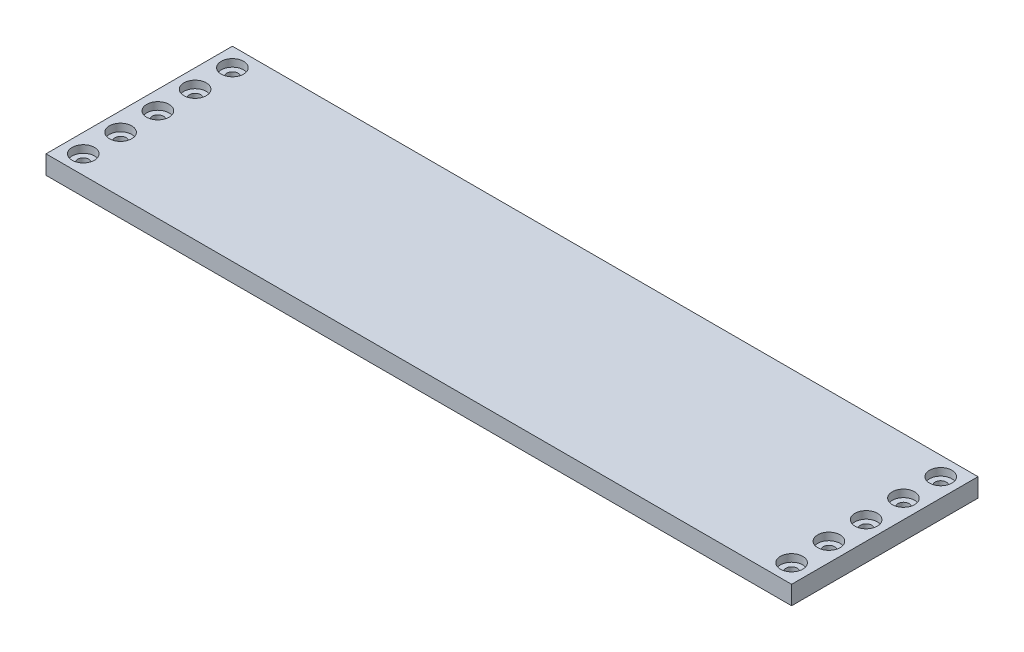
ISO-10303-21;
HEADER;
FILE_DESCRIPTION(('STEP AP214'),'2;1');
FILE_NAME('part.step','',(''),(''),'','','');
FILE_SCHEMA(('AUTOMOTIVE_DESIGN { 1 0 10303 214 1 1 1 1 }'));
ENDSEC;
DATA;
#1=APPLICATION_CONTEXT('core data for automotive mechanical design processes');
#2=APPLICATION_PROTOCOL_DEFINITION('international standard','automotive_design',2000,#1);
#3=PRODUCT_CONTEXT('',#1,'mechanical');
#4=PRODUCT('Part','Part','',(#3));
#5=PRODUCT_RELATED_PRODUCT_CATEGORY('part','',(#4));
#6=PRODUCT_DEFINITION_FORMATION('','',#4);
#7=PRODUCT_DEFINITION_CONTEXT('part definition',#1,'design');
#8=PRODUCT_DEFINITION('design','',#6,#7);
#9=PRODUCT_DEFINITION_SHAPE('','',#8);
#10=(LENGTH_UNIT() NAMED_UNIT(*) SI_UNIT(.MILLI.,.METRE.));
#11=(NAMED_UNIT(*) PLANE_ANGLE_UNIT() SI_UNIT($,.RADIAN.));
#12=(NAMED_UNIT(*) SI_UNIT($,.STERADIAN.) SOLID_ANGLE_UNIT());
#13=UNCERTAINTY_MEASURE_WITH_UNIT(LENGTH_MEASURE(1.E-05),#10,'distance_accuracy_value','');
#14=(GEOMETRIC_REPRESENTATION_CONTEXT(3) GLOBAL_UNCERTAINTY_ASSIGNED_CONTEXT((#13)) GLOBAL_UNIT_ASSIGNED_CONTEXT((#10,
#11,#12)) REPRESENTATION_CONTEXT('',''));
#15=CARTESIAN_POINT('',(0.,0.,0.));
#16=DIRECTION('',(0.,0.,1.));
#17=DIRECTION('',(1.,0.,0.));
#18=AXIS2_PLACEMENT_3D('',#15,#16,#17);
#19=CARTESIAN_POINT('',(-95.,0.,-20.));
#20=DIRECTION('',(0.,1.,0.));
#21=DIRECTION('',(0.,0.,1.));
#22=AXIS2_PLACEMENT_3D('',#19,#20,#21);
#23=CYLINDRICAL_SURFACE('',#22,1.5);
#24=CARTESIAN_POINT('',(-95.,0.,-20.));
#25=DIRECTION('',(0.,1.,0.));
#26=DIRECTION('',(0.,0.,1.));
#27=AXIS2_PLACEMENT_3D('',#24,#25,#26);
#28=CIRCLE('',#27,1.5);
#29=CARTESIAN_POINT('',(-95.,0.,-18.5));
#30=VERTEX_POINT('',#29);
#31=EDGE_CURVE('E107',#30,#30,#28,.T.);
#32=ORIENTED_EDGE('',*,*,#31,.F.);
#33=EDGE_LOOP('',(#32));
#34=FACE_BOUND('',#33,.T.);
#35=CARTESIAN_POINT('',(-95.,3.,-20.));
#36=DIRECTION('',(0.,1.,0.));
#37=DIRECTION('',(0.,0.,1.));
#38=AXIS2_PLACEMENT_3D('',#35,#36,#37);
#39=CIRCLE('',#38,1.5);
#40=CARTESIAN_POINT('',(-95.,3.,-18.5));
#41=VERTEX_POINT('',#40);
#42=EDGE_CURVE('E41',#41,#41,#39,.F.);
#43=ORIENTED_EDGE('',*,*,#42,.F.);
#44=EDGE_LOOP('',(#43));
#45=FACE_BOUND('',#44,.T.);
#46=ADVANCED_FACE('F37',(#34,#45),#23,.F.);
#47=CARTESIAN_POINT('',(94.9999999999998,0.,20.));
#48=DIRECTION('',(0.,1.,0.));
#49=DIRECTION('',(0.,0.,1.));
#50=AXIS2_PLACEMENT_3D('',#47,#48,#49);
#51=CYLINDRICAL_SURFACE('',#50,1.49999999999998);
#52=CARTESIAN_POINT('',(94.9999999999998,0.,20.));
#53=DIRECTION('',(0.,-1.,0.));
#54=DIRECTION('',(0.,0.,-1.));
#55=AXIS2_PLACEMENT_3D('',#52,#53,#54);
#56=CIRCLE('',#55,1.49999999999998);
#57=CARTESIAN_POINT('',(94.9999999999998,0.,18.5));
#58=VERTEX_POINT('',#57);
#59=EDGE_CURVE('E142',#58,#58,#56,.T.);
#60=ORIENTED_EDGE('',*,*,#59,.T.);
#61=EDGE_LOOP('',(#60));
#62=FACE_BOUND('',#61,.T.);
#63=CARTESIAN_POINT('',(94.9999999999998,3.,20.));
#64=DIRECTION('',(0.,1.,0.));
#65=DIRECTION('',(0.,0.,1.));
#66=AXIS2_PLACEMENT_3D('',#63,#64,#65);
#67=CIRCLE('',#66,1.49999999999998);
#68=CARTESIAN_POINT('',(94.9999999999998,3.,21.5));
#69=VERTEX_POINT('',#68);
#70=EDGE_CURVE('E137',#69,#69,#67,.T.);
#71=ORIENTED_EDGE('',*,*,#70,.T.);
#72=EDGE_LOOP('',(#71));
#73=FACE_BOUND('',#72,.T.);
#74=ADVANCED_FACE('F185',(#62,#73),#51,.F.);
#75=CARTESIAN_POINT('',(-94.9999999999998,0.,20.));
#76=DIRECTION('',(0.,1.,0.));
#77=DIRECTION('',(0.,0.,1.));
#78=AXIS2_PLACEMENT_3D('',#75,#76,#77);
#79=CYLINDRICAL_SURFACE('',#78,1.5);
#80=CARTESIAN_POINT('',(-94.9999999999998,0.,20.));
#81=DIRECTION('',(0.,1.,0.));
#82=DIRECTION('',(0.,0.,1.));
#83=AXIS2_PLACEMENT_3D('',#80,#81,#82);
#84=CIRCLE('',#83,1.5);
#85=CARTESIAN_POINT('',(-94.9999999999998,0.,21.5));
#86=VERTEX_POINT('',#85);
#87=EDGE_CURVE('E146',#86,#86,#84,.T.);
#88=ORIENTED_EDGE('',*,*,#87,.F.);
#89=EDGE_LOOP('',(#88));
#90=FACE_BOUND('',#89,.T.);
#91=CARTESIAN_POINT('',(-94.9999999999998,3.,20.));
#92=DIRECTION('',(0.,1.,0.));
#93=DIRECTION('',(0.,0.,1.));
#94=AXIS2_PLACEMENT_3D('',#91,#92,#93);
#95=CIRCLE('',#94,1.5);
#96=CARTESIAN_POINT('',(-94.9999999999998,3.,21.5));
#97=VERTEX_POINT('',#96);
#98=EDGE_CURVE('E135',#97,#97,#95,.F.);
#99=ORIENTED_EDGE('',*,*,#98,.F.);
#100=EDGE_LOOP('',(#99));
#101=FACE_BOUND('',#100,.T.);
#102=ADVANCED_FACE('F190',(#90,#101),#79,.F.);
#103=CARTESIAN_POINT('',(-94.9999999999997,0.,9.99999999999998));
#104=DIRECTION('',(0.,1.,0.));
#105=DIRECTION('',(0.,0.,1.));
#106=AXIS2_PLACEMENT_3D('',#103,#104,#105);
#107=CYLINDRICAL_SURFACE('',#106,1.5);
#108=CARTESIAN_POINT('',(-94.9999999999997,0.,9.99999999999998));
#109=DIRECTION('',(0.,1.,0.));
#110=DIRECTION('',(0.,0.,1.));
#111=AXIS2_PLACEMENT_3D('',#108,#109,#110);
#112=CIRCLE('',#111,1.5);
#113=CARTESIAN_POINT('',(-94.9999999999997,0.,11.5));
#114=VERTEX_POINT('',#113);
#115=EDGE_CURVE('E151',#114,#114,#112,.T.);
#116=ORIENTED_EDGE('',*,*,#115,.F.);
#117=EDGE_LOOP('',(#116));
#118=FACE_BOUND('',#117,.T.);
#119=CARTESIAN_POINT('',(-94.9999999999997,3.,9.99999999999998));
#120=DIRECTION('',(0.,1.,0.));
#121=DIRECTION('',(0.,0.,1.));
#122=AXIS2_PLACEMENT_3D('',#119,#120,#121);
#123=CIRCLE('',#122,1.5);
#124=CARTESIAN_POINT('',(-94.9999999999997,3.,11.5));
#125=VERTEX_POINT('',#124);
#126=EDGE_CURVE('E132',#125,#125,#123,.F.);
#127=ORIENTED_EDGE('',*,*,#126,.F.);
#128=EDGE_LOOP('',(#127));
#129=FACE_BOUND('',#128,.T.);
#130=ADVANCED_FACE('F272',(#118,#129),#107,.F.);
#131=CARTESIAN_POINT('',(-94.9999999999998,0.,0.));
#132=DIRECTION('',(0.,1.,0.));
#133=DIRECTION('',(0.,0.,1.));
#134=AXIS2_PLACEMENT_3D('',#131,#132,#133);
#135=CYLINDRICAL_SURFACE('',#134,1.5);
#136=CARTESIAN_POINT('',(-94.9999999999998,0.,0.));
#137=DIRECTION('',(0.,1.,0.));
#138=DIRECTION('',(0.,0.,1.));
#139=AXIS2_PLACEMENT_3D('',#136,#137,#138);
#140=CIRCLE('',#139,1.5);
#141=CARTESIAN_POINT('',(-94.9999999999998,0.,1.49999999999998));
#142=VERTEX_POINT('',#141);
#143=EDGE_CURVE('E172',#142,#142,#140,.T.);
#144=ORIENTED_EDGE('',*,*,#143,.F.);
#145=EDGE_LOOP('',(#144));
#146=FACE_BOUND('',#145,.T.);
#147=CARTESIAN_POINT('',(-94.9999999999998,3.,0.));
#148=DIRECTION('',(0.,1.,0.));
#149=DIRECTION('',(0.,0.,1.));
#150=AXIS2_PLACEMENT_3D('',#147,#148,#149);
#151=CIRCLE('',#150,1.5);
#152=CARTESIAN_POINT('',(-94.9999999999998,3.,1.49999999999998));
#153=VERTEX_POINT('',#152);
#154=EDGE_CURVE('E129',#153,#153,#151,.F.);
#155=ORIENTED_EDGE('',*,*,#154,.F.);
#156=EDGE_LOOP('',(#155));
#157=FACE_BOUND('',#156,.T.);
#158=ADVANCED_FACE('F264',(#146,#157),#135,.F.);
#159=CARTESIAN_POINT('',(-94.9999999999999,0.,-10.));
#160=DIRECTION('',(0.,1.,0.));
#161=DIRECTION('',(0.,0.,1.));
#162=AXIS2_PLACEMENT_3D('',#159,#160,#161);
#163=CYLINDRICAL_SURFACE('',#162,1.5);
#164=CARTESIAN_POINT('',(-94.9999999999999,0.,-10.));
#165=DIRECTION('',(0.,1.,0.));
#166=DIRECTION('',(0.,0.,1.));
#167=AXIS2_PLACEMENT_3D('',#164,#165,#166);
#168=CIRCLE('',#167,1.5);
#169=CARTESIAN_POINT('',(-94.9999999999999,0.,-8.50000000000001));
#170=VERTEX_POINT('',#169);
#171=EDGE_CURVE('E169',#170,#170,#168,.T.);
#172=ORIENTED_EDGE('',*,*,#171,.F.);
#173=EDGE_LOOP('',(#172));
#174=FACE_BOUND('',#173,.T.);
#175=CARTESIAN_POINT('',(-94.9999999999999,3.,-10.));
#176=DIRECTION('',(0.,1.,0.));
#177=DIRECTION('',(0.,0.,1.));
#178=AXIS2_PLACEMENT_3D('',#175,#176,#177);
#179=CIRCLE('',#178,1.5);
#180=CARTESIAN_POINT('',(-94.9999999999999,3.,-8.50000000000001));
#181=VERTEX_POINT('',#180);
#182=EDGE_CURVE('E126',#181,#181,#179,.F.);
#183=ORIENTED_EDGE('',*,*,#182,.F.);
#184=EDGE_LOOP('',(#183));
#185=FACE_BOUND('',#184,.T.);
#186=ADVANCED_FACE('F256',(#174,#185),#163,.F.);
#187=CARTESIAN_POINT('',(94.9999999999997,0.,9.99999999999998));
#188=DIRECTION('',(0.,1.,0.));
#189=DIRECTION('',(0.,0.,1.));
#190=AXIS2_PLACEMENT_3D('',#187,#188,#189);
#191=CYLINDRICAL_SURFACE('',#190,1.50000000000001);
#192=CARTESIAN_POINT('',(94.9999999999997,0.,9.99999999999998));
#193=DIRECTION('',(0.,-1.,0.));
#194=DIRECTION('',(0.,0.,-1.));
#195=AXIS2_PLACEMENT_3D('',#192,#193,#194);
#196=CIRCLE('',#195,1.50000000000001);
#197=CARTESIAN_POINT('',(94.9999999999997,0.,8.49999999999997));
#198=VERTEX_POINT('',#197);
#199=EDGE_CURVE('E166',#198,#198,#196,.T.);
#200=ORIENTED_EDGE('',*,*,#199,.T.);
#201=EDGE_LOOP('',(#200));
#202=FACE_BOUND('',#201,.T.);
#203=CARTESIAN_POINT('',(94.9999999999997,3.,9.99999999999998));
#204=DIRECTION('',(0.,1.,0.));
#205=DIRECTION('',(0.,0.,1.));
#206=AXIS2_PLACEMENT_3D('',#203,#204,#205);
#207=CIRCLE('',#206,1.50000000000001);
#208=CARTESIAN_POINT('',(94.9999999999997,3.,11.5));
#209=VERTEX_POINT('',#208);
#210=EDGE_CURVE('E123',#209,#209,#207,.T.);
#211=ORIENTED_EDGE('',*,*,#210,.T.);
#212=EDGE_LOOP('',(#211));
#213=FACE_BOUND('',#212,.T.);
#214=ADVANCED_FACE('F248',(#202,#213),#191,.F.);
#215=CARTESIAN_POINT('',(94.9999999999998,0.,0.));
#216=DIRECTION('',(0.,1.,0.));
#217=DIRECTION('',(0.,0.,1.));
#218=AXIS2_PLACEMENT_3D('',#215,#216,#217);
#219=CYLINDRICAL_SURFACE('',#218,1.49999999999998);
#220=CARTESIAN_POINT('',(94.9999999999998,0.,0.));
#221=DIRECTION('',(0.,-1.,0.));
#222=DIRECTION('',(0.,0.,-1.));
#223=AXIS2_PLACEMENT_3D('',#220,#221,#222);
#224=CIRCLE('',#223,1.49999999999998);
#225=CARTESIAN_POINT('',(94.9999999999998,0.,-1.5));
#226=VERTEX_POINT('',#225);
#227=EDGE_CURVE('E163',#226,#226,#224,.T.);
#228=ORIENTED_EDGE('',*,*,#227,.T.);
#229=EDGE_LOOP('',(#228));
#230=FACE_BOUND('',#229,.T.);
#231=CARTESIAN_POINT('',(94.9999999999998,3.,0.));
#232=DIRECTION('',(0.,1.,0.));
#233=DIRECTION('',(0.,0.,1.));
#234=AXIS2_PLACEMENT_3D('',#231,#232,#233);
#235=CIRCLE('',#234,1.49999999999998);
#236=CARTESIAN_POINT('',(94.9999999999998,3.,1.49999999999997));
#237=VERTEX_POINT('',#236);
#238=EDGE_CURVE('E120',#237,#237,#235,.T.);
#239=ORIENTED_EDGE('',*,*,#238,.T.);
#240=EDGE_LOOP('',(#239));
#241=FACE_BOUND('',#240,.T.);
#242=ADVANCED_FACE('F240',(#230,#241),#219,.F.);
#243=CARTESIAN_POINT('',(95.,0.,-20.));
#244=DIRECTION('',(0.,1.,0.));
#245=DIRECTION('',(0.,0.,1.));
#246=AXIS2_PLACEMENT_3D('',#243,#244,#245);
#247=CYLINDRICAL_SURFACE('',#246,1.49999999999998);
#248=CARTESIAN_POINT('',(95.,0.,-20.));
#249=DIRECTION('',(0.,-1.,0.));
#250=DIRECTION('',(0.,0.,-1.));
#251=AXIS2_PLACEMENT_3D('',#248,#249,#250);
#252=CIRCLE('',#251,1.49999999999998);
#253=CARTESIAN_POINT('',(95.,0.,-21.5));
#254=VERTEX_POINT('',#253);
#255=EDGE_CURVE('E160',#254,#254,#252,.T.);
#256=ORIENTED_EDGE('',*,*,#255,.T.);
#257=EDGE_LOOP('',(#256));
#258=FACE_BOUND('',#257,.T.);
#259=CARTESIAN_POINT('',(95.,3.,-20.));
#260=DIRECTION('',(0.,1.,0.));
#261=DIRECTION('',(0.,0.,1.));
#262=AXIS2_PLACEMENT_3D('',#259,#260,#261);
#263=CIRCLE('',#262,1.49999999999998);
#264=CARTESIAN_POINT('',(95.,3.,-18.5));
#265=VERTEX_POINT('',#264);
#266=EDGE_CURVE('E116',#265,#265,#263,.T.);
#267=ORIENTED_EDGE('',*,*,#266,.T.);
#268=EDGE_LOOP('',(#267));
#269=FACE_BOUND('',#268,.T.);
#270=ADVANCED_FACE('F232',(#258,#269),#247,.F.);
#271=CARTESIAN_POINT('',(94.9999999999999,0.,-10.));
#272=DIRECTION('',(0.,1.,0.));
#273=DIRECTION('',(0.,0.,1.));
#274=AXIS2_PLACEMENT_3D('',#271,#272,#273);
#275=CYLINDRICAL_SURFACE('',#274,1.50000000000001);
#276=CARTESIAN_POINT('',(94.9999999999999,0.,-10.));
#277=DIRECTION('',(0.,-1.,0.));
#278=DIRECTION('',(0.,0.,-1.));
#279=AXIS2_PLACEMENT_3D('',#276,#277,#278);
#280=CIRCLE('',#279,1.50000000000001);
#281=CARTESIAN_POINT('',(94.9999999999999,0.,-11.5));
#282=VERTEX_POINT('',#281);
#283=EDGE_CURVE('E157',#282,#282,#280,.T.);
#284=ORIENTED_EDGE('',*,*,#283,.T.);
#285=EDGE_LOOP('',(#284));
#286=FACE_BOUND('',#285,.T.);
#287=CARTESIAN_POINT('',(94.9999999999999,3.,-10.));
#288=DIRECTION('',(0.,1.,0.));
#289=DIRECTION('',(0.,0.,1.));
#290=AXIS2_PLACEMENT_3D('',#287,#288,#289);
#291=CIRCLE('',#290,1.50000000000001);
#292=CARTESIAN_POINT('',(94.9999999999999,3.,-8.5));
#293=VERTEX_POINT('',#292);
#294=EDGE_CURVE('E113',#293,#293,#291,.T.);
#295=ORIENTED_EDGE('',*,*,#294,.T.);
#296=EDGE_LOOP('',(#295));
#297=FACE_BOUND('',#296,.T.);
#298=ADVANCED_FACE('F197',(#286,#297),#275,.F.);
#299=CARTESIAN_POINT('',(0.,5.,0.));
#300=DIRECTION('',(0.,-1.,0.));
#301=DIRECTION('',(0.,0.,-1.));
#302=AXIS2_PLACEMENT_3D('',#299,#300,#301);
#303=PLANE('',#302);
#304=CARTESIAN_POINT('',(95.,5.,-20.));
#305=DIRECTION('',(0.,1.,0.));
#306=DIRECTION('',(0.,0.,1.));
#307=AXIS2_PLACEMENT_3D('',#304,#305,#306);
#308=CIRCLE('',#307,2.99999999999999);
#309=CARTESIAN_POINT('',(95.,5.,-17.));
#310=VERTEX_POINT('',#309);
#311=EDGE_CURVE('E590',#310,#310,#308,.T.);
#312=ORIENTED_EDGE('',*,*,#311,.F.);
#313=EDGE_LOOP('',(#312));
#314=FACE_BOUND('',#313,.T.);
#315=CARTESIAN_POINT('',(95.0000000000001,5.,-10.));
#316=DIRECTION('',(0.,1.,0.));
#317=DIRECTION('',(0.,0.,1.));
#318=AXIS2_PLACEMENT_3D('',#315,#316,#317);
#319=CIRCLE('',#318,2.99999999999999);
#320=CARTESIAN_POINT('',(95.0000000000001,5.,-7.00000000000001));
#321=VERTEX_POINT('',#320);
#322=EDGE_CURVE('E584',#321,#321,#319,.T.);
#323=ORIENTED_EDGE('',*,*,#322,.F.);
#324=EDGE_LOOP('',(#323));
#325=FACE_BOUND('',#324,.T.);
#326=CARTESIAN_POINT('',(95.0000000000002,5.,0.));
#327=DIRECTION('',(0.,1.,0.));
#328=DIRECTION('',(0.,0.,1.));
#329=AXIS2_PLACEMENT_3D('',#326,#327,#328);
#330=CIRCLE('',#329,2.99999999999999);
#331=CARTESIAN_POINT('',(95.0000000000002,5.,2.99999999999999));
#332=VERTEX_POINT('',#331);
#333=EDGE_CURVE('E578',#332,#332,#330,.T.);
#334=ORIENTED_EDGE('',*,*,#333,.F.);
#335=EDGE_LOOP('',(#334));
#336=FACE_BOUND('',#335,.T.);
#337=CARTESIAN_POINT('',(95.0000000000003,5.,10.));
#338=DIRECTION('',(0.,1.,0.));
#339=DIRECTION('',(0.,0.,1.));
#340=AXIS2_PLACEMENT_3D('',#337,#338,#339);
#341=CIRCLE('',#340,2.99999999999999);
#342=CARTESIAN_POINT('',(95.0000000000003,5.,13.));
#343=VERTEX_POINT('',#342);
#344=EDGE_CURVE('E572',#343,#343,#341,.T.);
#345=ORIENTED_EDGE('',*,*,#344,.F.);
#346=EDGE_LOOP('',(#345));
#347=FACE_BOUND('',#346,.T.);
#348=CARTESIAN_POINT('',(95.0000000000004,5.,20.));
#349=DIRECTION('',(0.,1.,0.));
#350=DIRECTION('',(0.,0.,1.));
#351=AXIS2_PLACEMENT_3D('',#348,#349,#350);
#352=CIRCLE('',#351,2.99999999999999);
#353=CARTESIAN_POINT('',(95.0000000000004,5.,23.));
#354=VERTEX_POINT('',#353);
#355=EDGE_CURVE('E566',#354,#354,#352,.T.);
#356=ORIENTED_EDGE('',*,*,#355,.F.);
#357=EDGE_LOOP('',(#356));
#358=FACE_BOUND('',#357,.T.);
#359=CARTESIAN_POINT('',(-94.9999999999996,5.,20.));
#360=DIRECTION('',(0.,1.,0.));
#361=DIRECTION('',(0.,0.,1.));
#362=AXIS2_PLACEMENT_3D('',#359,#360,#361);
#363=CIRCLE('',#362,3.00000000000001);
#364=CARTESIAN_POINT('',(-94.9999999999996,5.,23.));
#365=VERTEX_POINT('',#364);
#366=EDGE_CURVE('E560',#365,#365,#363,.T.);
#367=ORIENTED_EDGE('',*,*,#366,.F.);
#368=EDGE_LOOP('',(#367));
#369=FACE_BOUND('',#368,.T.);
#370=CARTESIAN_POINT('',(-94.9999999999997,5.,10.));
#371=DIRECTION('',(0.,1.,0.));
#372=DIRECTION('',(0.,0.,1.));
#373=AXIS2_PLACEMENT_3D('',#370,#371,#372);
#374=CIRCLE('',#373,3.00000000000001);
#375=CARTESIAN_POINT('',(-94.9999999999997,5.,13.));
#376=VERTEX_POINT('',#375);
#377=EDGE_CURVE('E554',#376,#376,#374,.T.);
#378=ORIENTED_EDGE('',*,*,#377,.F.);
#379=EDGE_LOOP('',(#378));
#380=FACE_BOUND('',#379,.T.);
#381=CARTESIAN_POINT('',(-94.9999999999998,5.,0.));
#382=DIRECTION('',(0.,1.,0.));
#383=DIRECTION('',(0.,0.,1.));
#384=AXIS2_PLACEMENT_3D('',#381,#382,#383);
#385=CIRCLE('',#384,3.00000000000001);
#386=CARTESIAN_POINT('',(-94.9999999999998,5.,3.));
#387=VERTEX_POINT('',#386);
#388=EDGE_CURVE('E546',#387,#387,#385,.T.);
#389=ORIENTED_EDGE('',*,*,#388,.F.);
#390=EDGE_LOOP('',(#389));
#391=FACE_BOUND('',#390,.T.);
#392=CARTESIAN_POINT('',(-94.9999999999999,5.,-10.));
#393=DIRECTION('',(0.,1.,0.));
#394=DIRECTION('',(0.,0.,1.));
#395=AXIS2_PLACEMENT_3D('',#392,#393,#394);
#396=CIRCLE('',#395,3.00000000000001);
#397=CARTESIAN_POINT('',(-94.9999999999999,5.,-7.));
#398=VERTEX_POINT('',#397);
#399=EDGE_CURVE('E539',#398,#398,#396,.T.);
#400=ORIENTED_EDGE('',*,*,#399,.F.);
#401=EDGE_LOOP('',(#400));
#402=FACE_BOUND('',#401,.T.);
#403=CARTESIAN_POINT('',(-95.,5.,-20.));
#404=DIRECTION('',(0.,1.,0.));
#405=DIRECTION('',(0.,0.,1.));
#406=AXIS2_PLACEMENT_3D('',#403,#404,#405);
#407=CIRCLE('',#406,3.00000000000001);
#408=CARTESIAN_POINT('',(-95.,5.,-17.));
#409=VERTEX_POINT('',#408);
#410=EDGE_CURVE('E155',#409,#409,#407,.T.);
#411=ORIENTED_EDGE('',*,*,#410,.F.);
#412=EDGE_LOOP('',(#411));
#413=FACE_BOUND('',#412,.T.);
#414=DIRECTION('',(0.,0.,-1.));
#415=VECTOR('',#414,1.);
#416=CARTESIAN_POINT('',(100.,5.,25.));
#417=LINE('',#416,#415);
#418=CARTESIAN_POINT('',(100.,5.,25.));
#419=VERTEX_POINT('',#418);
#420=CARTESIAN_POINT('',(100.,5.,-25.));
#421=VERTEX_POINT('',#420);
#422=EDGE_CURVE('E91',#419,#421,#417,.T.);
#423=ORIENTED_EDGE('',*,*,#422,.T.);
#424=DIRECTION('',(-1.,0.,0.));
#425=VECTOR('',#424,1.);
#426=CARTESIAN_POINT('',(-100.,5.,-25.));
#427=LINE('',#426,#425);
#428=CARTESIAN_POINT('',(-100.,5.,-25.));
#429=VERTEX_POINT('',#428);
#430=EDGE_CURVE('E86',#421,#429,#427,.T.);
#431=ORIENTED_EDGE('',*,*,#430,.T.);
#432=DIRECTION('',(0.,0.,1.));
#433=VECTOR('',#432,1.);
#434=CARTESIAN_POINT('',(-100.,5.,25.));
#435=LINE('',#434,#433);
#436=CARTESIAN_POINT('',(-100.,5.,25.));
#437=VERTEX_POINT('',#436);
#438=EDGE_CURVE('E89',#429,#437,#435,.T.);
#439=ORIENTED_EDGE('',*,*,#438,.T.);
#440=DIRECTION('',(1.,0.,0.));
#441=VECTOR('',#440,1.);
#442=CARTESIAN_POINT('',(-100.,5.,25.));
#443=LINE('',#442,#441);
#444=EDGE_CURVE('E56',#437,#419,#443,.T.);
#445=ORIENTED_EDGE('',*,*,#444,.T.);
#446=EDGE_LOOP('',(#423,#431,#439,#445));
#447=FACE_BOUND('',#446,.T.);
#448=ADVANCED_FACE('F87',(#314,#325,#336,#347,#358,#369,#380,#391,#402,#413,#447),#303,.F.);
#449=CARTESIAN_POINT('',(0.,0.,0.));
#450=DIRECTION('',(0.,-1.,0.));
#451=DIRECTION('',(0.,0.,-1.));
#452=AXIS2_PLACEMENT_3D('',#449,#450,#451);
#453=PLANE('',#452);
#454=ORIENTED_EDGE('',*,*,#255,.F.);
#455=EDGE_LOOP('',(#454));
#456=FACE_BOUND('',#455,.T.);
#457=ORIENTED_EDGE('',*,*,#199,.F.);
#458=EDGE_LOOP('',(#457));
#459=FACE_BOUND('',#458,.T.);
#460=ORIENTED_EDGE('',*,*,#171,.T.);
#461=EDGE_LOOP('',(#460));
#462=FACE_BOUND('',#461,.T.);
#463=ORIENTED_EDGE('',*,*,#143,.T.);
#464=EDGE_LOOP('',(#463));
#465=FACE_BOUND('',#464,.T.);
#466=ORIENTED_EDGE('',*,*,#115,.T.);
#467=EDGE_LOOP('',(#466));
#468=FACE_BOUND('',#467,.T.);
#469=ORIENTED_EDGE('',*,*,#87,.T.);
#470=EDGE_LOOP('',(#469));
#471=FACE_BOUND('',#470,.T.);
#472=DIRECTION('',(0.,0.,-1.));
#473=VECTOR('',#472,1.);
#474=CARTESIAN_POINT('',(100.,0.,25.));
#475=LINE('',#474,#473);
#476=CARTESIAN_POINT('',(100.,0.,25.));
#477=VERTEX_POINT('',#476);
#478=CARTESIAN_POINT('',(100.,0.,-25.));
#479=VERTEX_POINT('',#478);
#480=EDGE_CURVE('E104',#477,#479,#475,.T.);
#481=ORIENTED_EDGE('',*,*,#480,.F.);
#482=DIRECTION('',(1.,0.,0.));
#483=VECTOR('',#482,1.);
#484=CARTESIAN_POINT('',(-100.,0.,25.));
#485=LINE('',#484,#483);
#486=CARTESIAN_POINT('',(-100.,0.,25.));
#487=VERTEX_POINT('',#486);
#488=EDGE_CURVE('E79',#487,#477,#485,.T.);
#489=ORIENTED_EDGE('',*,*,#488,.F.);
#490=DIRECTION('',(0.,0.,1.));
#491=VECTOR('',#490,1.);
#492=CARTESIAN_POINT('',(-100.,0.,25.));
#493=LINE('',#492,#491);
#494=CARTESIAN_POINT('',(-100.,0.,-25.));
#495=VERTEX_POINT('',#494);
#496=EDGE_CURVE('E73',#495,#487,#493,.T.);
#497=ORIENTED_EDGE('',*,*,#496,.F.);
#498=DIRECTION('',(-1.,0.,0.));
#499=VECTOR('',#498,1.);
#500=CARTESIAN_POINT('',(-100.,0.,-25.));
#501=LINE('',#500,#499);
#502=EDGE_CURVE('E95',#479,#495,#501,.T.);
#503=ORIENTED_EDGE('',*,*,#502,.F.);
#504=EDGE_LOOP('',(#481,#489,#497,#503));
#505=FACE_BOUND('',#504,.T.);
#506=ORIENTED_EDGE('',*,*,#31,.T.);
#507=EDGE_LOOP('',(#506));
#508=FACE_BOUND('',#507,.T.);
#509=ORIENTED_EDGE('',*,*,#59,.F.);
#510=EDGE_LOOP('',(#509));
#511=FACE_BOUND('',#510,.T.);
#512=ORIENTED_EDGE('',*,*,#227,.F.);
#513=EDGE_LOOP('',(#512));
#514=FACE_BOUND('',#513,.T.);
#515=ORIENTED_EDGE('',*,*,#283,.F.);
#516=EDGE_LOOP('',(#515));
#517=FACE_BOUND('',#516,.T.);
#518=ADVANCED_FACE('F180',(#456,#459,#462,#465,#468,#471,#505,#508,#511,#514,#517),#453,.T.);
#519=CARTESIAN_POINT('',(100.,5.,25.));
#520=DIRECTION('',(-1.,0.,0.));
#521=DIRECTION('',(0.,0.,1.));
#522=AXIS2_PLACEMENT_3D('',#519,#520,#521);
#523=PLANE('',#522);
#524=ORIENTED_EDGE('',*,*,#480,.T.);
#525=DIRECTION('',(0.,-1.,0.));
#526=VECTOR('',#525,1.);
#527=CARTESIAN_POINT('',(100.,5.,-25.));
#528=LINE('',#527,#526);
#529=EDGE_CURVE('E11',#421,#479,#528,.T.);
#530=ORIENTED_EDGE('',*,*,#529,.F.);
#531=ORIENTED_EDGE('',*,*,#422,.F.);
#532=DIRECTION('',(0.,-1.,0.));
#533=VECTOR('',#532,1.);
#534=CARTESIAN_POINT('',(100.,5.,25.));
#535=LINE('',#534,#533);
#536=EDGE_CURVE('E100',#419,#477,#535,.T.);
#537=ORIENTED_EDGE('',*,*,#536,.T.);
#538=EDGE_LOOP('',(#524,#530,#531,#537));
#539=FACE_BOUND('',#538,.T.);
#540=ADVANCED_FACE('F39',(#539),#523,.F.);
#541=CARTESIAN_POINT('',(-100.,5.,-25.));
#542=DIRECTION('',(0.,0.,1.));
#543=DIRECTION('',(1.,0.,0.));
#544=AXIS2_PLACEMENT_3D('',#541,#542,#543);
#545=PLANE('',#544);
#546=ORIENTED_EDGE('',*,*,#502,.T.);
#547=DIRECTION('',(0.,-1.,0.));
#548=VECTOR('',#547,1.);
#549=CARTESIAN_POINT('',(-100.,5.,-25.));
#550=LINE('',#549,#548);
#551=EDGE_CURVE('E47',#429,#495,#550,.T.);
#552=ORIENTED_EDGE('',*,*,#551,.F.);
#553=ORIENTED_EDGE('',*,*,#430,.F.);
#554=ORIENTED_EDGE('',*,*,#529,.T.);
#555=EDGE_LOOP('',(#546,#552,#553,#554));
#556=FACE_BOUND('',#555,.T.);
#557=ADVANCED_FACE('F94',(#556),#545,.F.);
#558=CARTESIAN_POINT('',(-100.,5.,25.));
#559=DIRECTION('',(1.,0.,0.));
#560=DIRECTION('',(0.,0.,-1.));
#561=AXIS2_PLACEMENT_3D('',#558,#559,#560);
#562=PLANE('',#561);
#563=ORIENTED_EDGE('',*,*,#496,.T.);
#564=DIRECTION('',(0.,-1.,0.));
#565=VECTOR('',#564,1.);
#566=CARTESIAN_POINT('',(-100.,5.,25.));
#567=LINE('',#566,#565);
#568=EDGE_CURVE('E96',#437,#487,#567,.T.);
#569=ORIENTED_EDGE('',*,*,#568,.F.);
#570=ORIENTED_EDGE('',*,*,#438,.F.);
#571=ORIENTED_EDGE('',*,*,#551,.T.);
#572=EDGE_LOOP('',(#563,#569,#570,#571));
#573=FACE_BOUND('',#572,.T.);
#574=ADVANCED_FACE('F98',(#573),#562,.F.);
#575=CARTESIAN_POINT('',(-100.,5.,25.));
#576=DIRECTION('',(0.,0.,-1.));
#577=DIRECTION('',(-1.,0.,0.));
#578=AXIS2_PLACEMENT_3D('',#575,#576,#577);
#579=PLANE('',#578);
#580=ORIENTED_EDGE('',*,*,#488,.T.);
#581=ORIENTED_EDGE('',*,*,#536,.F.);
#582=ORIENTED_EDGE('',*,*,#444,.F.);
#583=ORIENTED_EDGE('',*,*,#568,.T.);
#584=EDGE_LOOP('',(#580,#581,#582,#583));
#585=FACE_BOUND('',#584,.T.);
#586=ADVANCED_FACE('F202',(#585),#579,.F.);
#587=CARTESIAN_POINT('',(95.0000000000001,3.,-10.));
#588=DIRECTION('',(0.,1.,0.));
#589=DIRECTION('',(0.,0.,1.));
#590=AXIS2_PLACEMENT_3D('',#587,#588,#589);
#591=CYLINDRICAL_SURFACE('',#590,2.99999999999999);
#592=CARTESIAN_POINT('',(95.0000000000001,3.,-10.));
#593=DIRECTION('',(0.,1.,0.));
#594=DIRECTION('',(0.,0.,1.));
#595=AXIS2_PLACEMENT_3D('',#592,#593,#594);
#596=CIRCLE('',#595,2.99999999999999);
#597=CARTESIAN_POINT('',(95.0000000000001,3.,-7.00000000000001));
#598=VERTEX_POINT('',#597);
#599=EDGE_CURVE('E587',#598,#598,#596,.T.);
#600=ORIENTED_EDGE('',*,*,#599,.F.);
#601=EDGE_LOOP('',(#600));
#602=FACE_BOUND('',#601,.T.);
#603=ORIENTED_EDGE('',*,*,#322,.T.);
#604=EDGE_LOOP('',(#603));
#605=FACE_BOUND('',#604,.T.);
#606=ADVANCED_FACE('F205',(#602,#605),#591,.F.);
#607=CARTESIAN_POINT('',(95.0000000000001,3.,-10.));
#608=DIRECTION('',(0.,1.,0.));
#609=DIRECTION('',(0.,0.,1.));
#610=AXIS2_PLACEMENT_3D('',#607,#608,#609);
#611=PLANE('',#610);
#612=ORIENTED_EDGE('',*,*,#294,.F.);
#613=EDGE_LOOP('',(#612));
#614=FACE_BOUND('',#613,.T.);
#615=ORIENTED_EDGE('',*,*,#599,.T.);
#616=EDGE_LOOP('',(#615));
#617=FACE_BOUND('',#616,.T.);
#618=ADVANCED_FACE('F303',(#614,#617),#611,.T.);
#619=CARTESIAN_POINT('',(95.,3.,-20.));
#620=DIRECTION('',(0.,1.,0.));
#621=DIRECTION('',(0.,0.,1.));
#622=AXIS2_PLACEMENT_3D('',#619,#620,#621);
#623=CYLINDRICAL_SURFACE('',#622,2.99999999999999);
#624=CARTESIAN_POINT('',(95.,3.,-20.));
#625=DIRECTION('',(0.,1.,0.));
#626=DIRECTION('',(0.,0.,1.));
#627=AXIS2_PLACEMENT_3D('',#624,#625,#626);
#628=CIRCLE('',#627,2.99999999999999);
#629=CARTESIAN_POINT('',(95.,3.,-17.));
#630=VERTEX_POINT('',#629);
#631=EDGE_CURVE('E593',#630,#630,#628,.T.);
#632=ORIENTED_EDGE('',*,*,#631,.F.);
#633=EDGE_LOOP('',(#632));
#634=FACE_BOUND('',#633,.T.);
#635=ORIENTED_EDGE('',*,*,#311,.T.);
#636=EDGE_LOOP('',(#635));
#637=FACE_BOUND('',#636,.T.);
#638=ADVANCED_FACE('F312',(#634,#637),#623,.F.);
#639=CARTESIAN_POINT('',(95.,3.,-20.));
#640=DIRECTION('',(0.,1.,0.));
#641=DIRECTION('',(0.,0.,1.));
#642=AXIS2_PLACEMENT_3D('',#639,#640,#641);
#643=PLANE('',#642);
#644=ORIENTED_EDGE('',*,*,#266,.F.);
#645=EDGE_LOOP('',(#644));
#646=FACE_BOUND('',#645,.T.);
#647=ORIENTED_EDGE('',*,*,#631,.T.);
#648=EDGE_LOOP('',(#647));
#649=FACE_BOUND('',#648,.T.);
#650=ADVANCED_FACE('F321',(#646,#649),#643,.T.);
#651=CARTESIAN_POINT('',(95.0000000000002,3.,0.));
#652=DIRECTION('',(0.,1.,0.));
#653=DIRECTION('',(0.,0.,1.));
#654=AXIS2_PLACEMENT_3D('',#651,#652,#653);
#655=CYLINDRICAL_SURFACE('',#654,2.99999999999999);
#656=CARTESIAN_POINT('',(95.0000000000002,3.,0.));
#657=DIRECTION('',(0.,1.,0.));
#658=DIRECTION('',(0.,0.,1.));
#659=AXIS2_PLACEMENT_3D('',#656,#657,#658);
#660=CIRCLE('',#659,2.99999999999999);
#661=CARTESIAN_POINT('',(95.0000000000002,3.,2.99999999999999));
#662=VERTEX_POINT('',#661);
#663=EDGE_CURVE('E581',#662,#662,#660,.T.);
#664=ORIENTED_EDGE('',*,*,#663,.F.);
#665=EDGE_LOOP('',(#664));
#666=FACE_BOUND('',#665,.T.);
#667=ORIENTED_EDGE('',*,*,#333,.T.);
#668=EDGE_LOOP('',(#667));
#669=FACE_BOUND('',#668,.T.);
#670=ADVANCED_FACE('F330',(#666,#669),#655,.F.);
#671=CARTESIAN_POINT('',(95.0000000000002,3.,0.));
#672=DIRECTION('',(0.,1.,0.));
#673=DIRECTION('',(0.,0.,1.));
#674=AXIS2_PLACEMENT_3D('',#671,#672,#673);
#675=PLANE('',#674);
#676=ORIENTED_EDGE('',*,*,#238,.F.);
#677=EDGE_LOOP('',(#676));
#678=FACE_BOUND('',#677,.T.);
#679=ORIENTED_EDGE('',*,*,#663,.T.);
#680=EDGE_LOOP('',(#679));
#681=FACE_BOUND('',#680,.T.);
#682=ADVANCED_FACE('F339',(#678,#681),#675,.T.);
#683=CARTESIAN_POINT('',(95.0000000000003,3.,10.));
#684=DIRECTION('',(0.,1.,0.));
#685=DIRECTION('',(0.,0.,1.));
#686=AXIS2_PLACEMENT_3D('',#683,#684,#685);
#687=CYLINDRICAL_SURFACE('',#686,2.99999999999999);
#688=CARTESIAN_POINT('',(95.0000000000003,3.,10.));
#689=DIRECTION('',(0.,1.,0.));
#690=DIRECTION('',(0.,0.,1.));
#691=AXIS2_PLACEMENT_3D('',#688,#689,#690);
#692=CIRCLE('',#691,2.99999999999999);
#693=CARTESIAN_POINT('',(95.0000000000003,3.,13.));
#694=VERTEX_POINT('',#693);
#695=EDGE_CURVE('E575',#694,#694,#692,.T.);
#696=ORIENTED_EDGE('',*,*,#695,.F.);
#697=EDGE_LOOP('',(#696));
#698=FACE_BOUND('',#697,.T.);
#699=ORIENTED_EDGE('',*,*,#344,.T.);
#700=EDGE_LOOP('',(#699));
#701=FACE_BOUND('',#700,.T.);
#702=ADVANCED_FACE('F348',(#698,#701),#687,.F.);
#703=CARTESIAN_POINT('',(95.0000000000003,3.,10.));
#704=DIRECTION('',(0.,1.,0.));
#705=DIRECTION('',(0.,0.,1.));
#706=AXIS2_PLACEMENT_3D('',#703,#704,#705);
#707=PLANE('',#706);
#708=ORIENTED_EDGE('',*,*,#210,.F.);
#709=EDGE_LOOP('',(#708));
#710=FACE_BOUND('',#709,.T.);
#711=ORIENTED_EDGE('',*,*,#695,.T.);
#712=EDGE_LOOP('',(#711));
#713=FACE_BOUND('',#712,.T.);
#714=ADVANCED_FACE('F357',(#710,#713),#707,.T.);
#715=CARTESIAN_POINT('',(-94.9999999999999,3.,-10.));
#716=DIRECTION('',(0.,1.,0.));
#717=DIRECTION('',(0.,0.,1.));
#718=AXIS2_PLACEMENT_3D('',#715,#716,#717);
#719=PLANE('',#718);
#720=CARTESIAN_POINT('',(-94.9999999999999,3.,-10.));
#721=DIRECTION('',(0.,1.,0.));
#722=DIRECTION('',(0.,0.,1.));
#723=AXIS2_PLACEMENT_3D('',#720,#721,#722);
#724=CIRCLE('',#723,3.00000000000001);
#725=CARTESIAN_POINT('',(-94.9999999999999,3.,-7.));
#726=VERTEX_POINT('',#725);
#727=EDGE_CURVE('E541',#726,#726,#724,.T.);
#728=ORIENTED_EDGE('',*,*,#727,.T.);
#729=EDGE_LOOP('',(#728));
#730=FACE_BOUND('',#729,.T.);
#731=ORIENTED_EDGE('',*,*,#182,.T.);
#732=EDGE_LOOP('',(#731));
#733=FACE_BOUND('',#732,.T.);
#734=ADVANCED_FACE('F366',(#730,#733),#719,.T.);
#735=CARTESIAN_POINT('',(-94.9999999999999,3.,-10.));
#736=DIRECTION('',(0.,1.,0.));
#737=DIRECTION('',(0.,0.,1.));
#738=AXIS2_PLACEMENT_3D('',#735,#736,#737);
#739=CYLINDRICAL_SURFACE('',#738,3.00000000000001);
#740=ORIENTED_EDGE('',*,*,#727,.F.);
#741=EDGE_LOOP('',(#740));
#742=FACE_BOUND('',#741,.T.);
#743=ORIENTED_EDGE('',*,*,#399,.T.);
#744=EDGE_LOOP('',(#743));
#745=FACE_BOUND('',#744,.T.);
#746=ADVANCED_FACE('F375',(#742,#745),#739,.F.);
#747=CARTESIAN_POINT('',(-94.9999999999998,3.,0.));
#748=DIRECTION('',(0.,1.,0.));
#749=DIRECTION('',(0.,0.,1.));
#750=AXIS2_PLACEMENT_3D('',#747,#748,#749);
#751=PLANE('',#750);
#752=CARTESIAN_POINT('',(-94.9999999999998,3.,0.));
#753=DIRECTION('',(0.,1.,0.));
#754=DIRECTION('',(0.,0.,1.));
#755=AXIS2_PLACEMENT_3D('',#752,#753,#754);
#756=CIRCLE('',#755,3.00000000000001);
#757=CARTESIAN_POINT('',(-94.9999999999998,3.,3.));
#758=VERTEX_POINT('',#757);
#759=EDGE_CURVE('E551',#758,#758,#756,.T.);
#760=ORIENTED_EDGE('',*,*,#759,.T.);
#761=EDGE_LOOP('',(#760));
#762=FACE_BOUND('',#761,.T.);
#763=ORIENTED_EDGE('',*,*,#154,.T.);
#764=EDGE_LOOP('',(#763));
#765=FACE_BOUND('',#764,.T.);
#766=ADVANCED_FACE('F384',(#762,#765),#751,.T.);
#767=CARTESIAN_POINT('',(-94.9999999999998,3.,0.));
#768=DIRECTION('',(0.,1.,0.));
#769=DIRECTION('',(0.,0.,1.));
#770=AXIS2_PLACEMENT_3D('',#767,#768,#769);
#771=CYLINDRICAL_SURFACE('',#770,3.00000000000001);
#772=ORIENTED_EDGE('',*,*,#759,.F.);
#773=EDGE_LOOP('',(#772));
#774=FACE_BOUND('',#773,.T.);
#775=ORIENTED_EDGE('',*,*,#388,.T.);
#776=EDGE_LOOP('',(#775));
#777=FACE_BOUND('',#776,.T.);
#778=ADVANCED_FACE('F393',(#774,#777),#771,.F.);
#779=CARTESIAN_POINT('',(-94.9999999999997,3.,10.));
#780=DIRECTION('',(0.,1.,0.));
#781=DIRECTION('',(0.,0.,1.));
#782=AXIS2_PLACEMENT_3D('',#779,#780,#781);
#783=PLANE('',#782);
#784=CARTESIAN_POINT('',(-94.9999999999997,3.,10.));
#785=DIRECTION('',(0.,1.,0.));
#786=DIRECTION('',(0.,0.,1.));
#787=AXIS2_PLACEMENT_3D('',#784,#785,#786);
#788=CIRCLE('',#787,3.00000000000001);
#789=CARTESIAN_POINT('',(-94.9999999999997,3.,13.));
#790=VERTEX_POINT('',#789);
#791=EDGE_CURVE('E557',#790,#790,#788,.T.);
#792=ORIENTED_EDGE('',*,*,#791,.T.);
#793=EDGE_LOOP('',(#792));
#794=FACE_BOUND('',#793,.T.);
#795=ORIENTED_EDGE('',*,*,#126,.T.);
#796=EDGE_LOOP('',(#795));
#797=FACE_BOUND('',#796,.T.);
#798=ADVANCED_FACE('F402',(#794,#797),#783,.T.);
#799=CARTESIAN_POINT('',(-94.9999999999997,3.,10.));
#800=DIRECTION('',(0.,1.,0.));
#801=DIRECTION('',(0.,0.,1.));
#802=AXIS2_PLACEMENT_3D('',#799,#800,#801);
#803=CYLINDRICAL_SURFACE('',#802,3.00000000000001);
#804=ORIENTED_EDGE('',*,*,#791,.F.);
#805=EDGE_LOOP('',(#804));
#806=FACE_BOUND('',#805,.T.);
#807=ORIENTED_EDGE('',*,*,#377,.T.);
#808=EDGE_LOOP('',(#807));
#809=FACE_BOUND('',#808,.T.);
#810=ADVANCED_FACE('F411',(#806,#809),#803,.F.);
#811=CARTESIAN_POINT('',(-94.9999999999996,3.,20.));
#812=DIRECTION('',(0.,1.,0.));
#813=DIRECTION('',(0.,0.,1.));
#814=AXIS2_PLACEMENT_3D('',#811,#812,#813);
#815=PLANE('',#814);
#816=CARTESIAN_POINT('',(-94.9999999999996,3.,20.));
#817=DIRECTION('',(0.,1.,0.));
#818=DIRECTION('',(0.,0.,1.));
#819=AXIS2_PLACEMENT_3D('',#816,#817,#818);
#820=CIRCLE('',#819,3.00000000000001);
#821=CARTESIAN_POINT('',(-94.9999999999996,3.,23.));
#822=VERTEX_POINT('',#821);
#823=EDGE_CURVE('E563',#822,#822,#820,.T.);
#824=ORIENTED_EDGE('',*,*,#823,.T.);
#825=EDGE_LOOP('',(#824));
#826=FACE_BOUND('',#825,.T.);
#827=ORIENTED_EDGE('',*,*,#98,.T.);
#828=EDGE_LOOP('',(#827));
#829=FACE_BOUND('',#828,.T.);
#830=ADVANCED_FACE('F420',(#826,#829),#815,.T.);
#831=CARTESIAN_POINT('',(-94.9999999999996,3.,20.));
#832=DIRECTION('',(0.,1.,0.));
#833=DIRECTION('',(0.,0.,1.));
#834=AXIS2_PLACEMENT_3D('',#831,#832,#833);
#835=CYLINDRICAL_SURFACE('',#834,3.00000000000001);
#836=ORIENTED_EDGE('',*,*,#823,.F.);
#837=EDGE_LOOP('',(#836));
#838=FACE_BOUND('',#837,.T.);
#839=ORIENTED_EDGE('',*,*,#366,.T.);
#840=EDGE_LOOP('',(#839));
#841=FACE_BOUND('',#840,.T.);
#842=ADVANCED_FACE('F429',(#838,#841),#835,.F.);
#843=CARTESIAN_POINT('',(95.0000000000004,3.,20.));
#844=DIRECTION('',(0.,1.,0.));
#845=DIRECTION('',(0.,0.,1.));
#846=AXIS2_PLACEMENT_3D('',#843,#844,#845);
#847=CYLINDRICAL_SURFACE('',#846,2.99999999999999);
#848=CARTESIAN_POINT('',(95.0000000000004,3.,20.));
#849=DIRECTION('',(0.,1.,0.));
#850=DIRECTION('',(0.,0.,1.));
#851=AXIS2_PLACEMENT_3D('',#848,#849,#850);
#852=CIRCLE('',#851,2.99999999999999);
#853=CARTESIAN_POINT('',(95.0000000000004,3.,23.));
#854=VERTEX_POINT('',#853);
#855=EDGE_CURVE('E569',#854,#854,#852,.T.);
#856=ORIENTED_EDGE('',*,*,#855,.F.);
#857=EDGE_LOOP('',(#856));
#858=FACE_BOUND('',#857,.T.);
#859=ORIENTED_EDGE('',*,*,#355,.T.);
#860=EDGE_LOOP('',(#859));
#861=FACE_BOUND('',#860,.T.);
#862=ADVANCED_FACE('F438',(#858,#861),#847,.F.);
#863=CARTESIAN_POINT('',(95.0000000000004,3.,20.));
#864=DIRECTION('',(0.,1.,0.));
#865=DIRECTION('',(0.,0.,1.));
#866=AXIS2_PLACEMENT_3D('',#863,#864,#865);
#867=PLANE('',#866);
#868=ORIENTED_EDGE('',*,*,#70,.F.);
#869=EDGE_LOOP('',(#868));
#870=FACE_BOUND('',#869,.T.);
#871=ORIENTED_EDGE('',*,*,#855,.T.);
#872=EDGE_LOOP('',(#871));
#873=FACE_BOUND('',#872,.T.);
#874=ADVANCED_FACE('F447',(#870,#873),#867,.T.);
#875=CARTESIAN_POINT('',(-95.,3.,-20.));
#876=DIRECTION('',(0.,1.,0.));
#877=DIRECTION('',(0.,0.,1.));
#878=AXIS2_PLACEMENT_3D('',#875,#876,#877);
#879=PLANE('',#878);
#880=CARTESIAN_POINT('',(-95.,3.,-20.));
#881=DIRECTION('',(0.,1.,0.));
#882=DIRECTION('',(0.,0.,1.));
#883=AXIS2_PLACEMENT_3D('',#880,#881,#882);
#884=CIRCLE('',#883,3.00000000000001);
#885=CARTESIAN_POINT('',(-95.,3.,-17.));
#886=VERTEX_POINT('',#885);
#887=EDGE_CURVE('E117',#886,#886,#884,.T.);
#888=ORIENTED_EDGE('',*,*,#887,.T.);
#889=EDGE_LOOP('',(#888));
#890=FACE_BOUND('',#889,.T.);
#891=ORIENTED_EDGE('',*,*,#42,.T.);
#892=EDGE_LOOP('',(#891));
#893=FACE_BOUND('',#892,.T.);
#894=ADVANCED_FACE('F456',(#890,#893),#879,.T.);
#895=CARTESIAN_POINT('',(-95.,3.,-20.));
#896=DIRECTION('',(0.,1.,0.));
#897=DIRECTION('',(0.,0.,1.));
#898=AXIS2_PLACEMENT_3D('',#895,#896,#897);
#899=CYLINDRICAL_SURFACE('',#898,3.00000000000001);
#900=ORIENTED_EDGE('',*,*,#887,.F.);
#901=EDGE_LOOP('',(#900));
#902=FACE_BOUND('',#901,.T.);
#903=ORIENTED_EDGE('',*,*,#410,.T.);
#904=EDGE_LOOP('',(#903));
#905=FACE_BOUND('',#904,.T.);
#906=ADVANCED_FACE('F465',(#902,#905),#899,.F.);
#907=CLOSED_SHELL('',(#46,#74,#102,#130,#158,#186,#214,#242,#270,#298,#448,#518,#540,#557,#574,
#586,#606,#618,#638,#650,#670,#682,#702,#714,#734,#746,#766,#778,#798,#810,#830,#842,#862,#874,
#894,#906));
#908=MANIFOLD_SOLID_BREP('B2',#907);
#909=ADVANCED_BREP_SHAPE_REPRESENTATION('',(#18,#908),#14);
#910=SHAPE_DEFINITION_REPRESENTATION(#9,#909);
ENDSEC;
END-ISO-10303-21;
